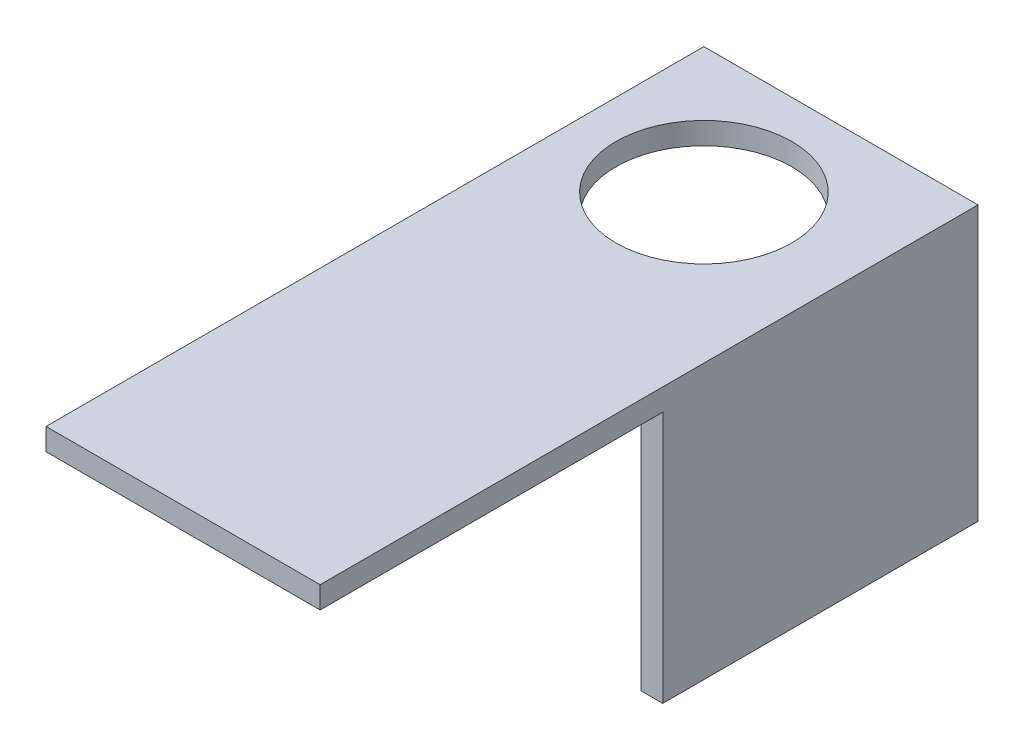
ISO-10303-21;
HEADER;
FILE_DESCRIPTION(('STEP AP214'),'2;1');
FILE_NAME('part.step','',(''),(''),'','','');
FILE_SCHEMA(('AUTOMOTIVE_DESIGN { 1 0 10303 214 1 1 1 1 }'));
ENDSEC;
DATA;
#1=APPLICATION_CONTEXT('core data for automotive mechanical design processes');
#2=APPLICATION_PROTOCOL_DEFINITION('international standard','automotive_design',2000,#1);
#3=PRODUCT_CONTEXT('',#1,'mechanical');
#4=PRODUCT('Part','Part','',(#3));
#5=PRODUCT_RELATED_PRODUCT_CATEGORY('part','',(#4));
#6=PRODUCT_DEFINITION_FORMATION('','',#4);
#7=PRODUCT_DEFINITION_CONTEXT('part definition',#1,'design');
#8=PRODUCT_DEFINITION('design','',#6,#7);
#9=PRODUCT_DEFINITION_SHAPE('','',#8);
#10=(LENGTH_UNIT() NAMED_UNIT(*) SI_UNIT(.MILLI.,.METRE.));
#11=(NAMED_UNIT(*) PLANE_ANGLE_UNIT() SI_UNIT($,.RADIAN.));
#12=(NAMED_UNIT(*) SI_UNIT($,.STERADIAN.) SOLID_ANGLE_UNIT());
#13=UNCERTAINTY_MEASURE_WITH_UNIT(LENGTH_MEASURE(1.E-05),#10,'distance_accuracy_value','');
#14=(GEOMETRIC_REPRESENTATION_CONTEXT(3) GLOBAL_UNCERTAINTY_ASSIGNED_CONTEXT((#13)) GLOBAL_UNIT_ASSIGNED_CONTEXT((#10,
#11,#12)) REPRESENTATION_CONTEXT('',''));
#15=CARTESIAN_POINT('',(0.,0.,0.));
#16=DIRECTION('',(0.,0.,1.));
#17=DIRECTION('',(1.,0.,0.));
#18=AXIS2_PLACEMENT_3D('',#15,#16,#17);
#19=CARTESIAN_POINT('',(-124.610735746152,44.9639966273187,120.));
#20=DIRECTION('',(1.,0.,0.));
#21=DIRECTION('',(0.,0.,-1.));
#22=AXIS2_PLACEMENT_3D('',#19,#20,#21);
#23=PLANE('',#22);
#24=DIRECTION('',(0.,-1.,0.));
#25=VECTOR('',#24,1.);
#26=CARTESIAN_POINT('',(-124.610735746152,44.9639966273187,0.));
#27=LINE('',#26,#25);
#28=CARTESIAN_POINT('',(-124.610735746152,44.9639966273187,0.));
#29=VERTEX_POINT('',#28);
#30=CARTESIAN_POINT('',(-124.610735746152,40.9639966273187,0.));
#31=VERTEX_POINT('',#30);
#32=EDGE_CURVE('E116',#29,#31,#27,.T.);
#33=ORIENTED_EDGE('',*,*,#32,.T.);
#34=DIRECTION('',(0.,0.,-1.));
#35=VECTOR('',#34,1.);
#36=CARTESIAN_POINT('',(-124.610735746152,40.9639966273187,120.));
#37=LINE('',#36,#35);
#38=CARTESIAN_POINT('',(-124.610735746152,40.9639966273187,120.));
#39=VERTEX_POINT('',#38);
#40=EDGE_CURVE('E40',#39,#31,#37,.T.);
#41=ORIENTED_EDGE('',*,*,#40,.F.);
#42=DIRECTION('',(0.,-1.,0.));
#43=VECTOR('',#42,1.);
#44=CARTESIAN_POINT('',(-124.610735746152,44.9639966273187,120.));
#45=LINE('',#44,#43);
#46=CARTESIAN_POINT('',(-124.610735746152,44.9639966273187,120.));
#47=VERTEX_POINT('',#46);
#48=EDGE_CURVE('E120',#47,#39,#45,.T.);
#49=ORIENTED_EDGE('',*,*,#48,.F.);
#50=DIRECTION('',(0.,0.,-1.));
#51=VECTOR('',#50,1.);
#52=CARTESIAN_POINT('',(-124.610735746152,44.9639966273187,120.));
#53=LINE('',#52,#51);
#54=EDGE_CURVE('E125',#47,#29,#53,.T.);
#55=ORIENTED_EDGE('',*,*,#54,.T.);
#56=EDGE_LOOP('',(#33,#41,#49,#55));
#57=FACE_BOUND('',#56,.T.);
#58=ADVANCED_FACE('F32',(#57),#23,.F.);
#59=CARTESIAN_POINT('',(-124.610735746152,40.9639966273187,120.));
#60=DIRECTION('',(0.,1.,0.));
#61=DIRECTION('',(0.,0.,1.));
#62=AXIS2_PLACEMENT_3D('',#59,#60,#61);
#63=PLANE('',#62);
#64=CARTESIAN_POINT('',(-101.610735746152,40.9639966273187,23.));
#65=DIRECTION('',(0.,1.,0.));
#66=DIRECTION('',(0.,0.,1.));
#67=AXIS2_PLACEMENT_3D('',#64,#65,#66);
#68=CIRCLE('',#67,16.0398057371052);
#69=CARTESIAN_POINT('',(-101.610735746152,40.9639966273187,6.96019426289482));
#70=VERTEX_POINT('',#69);
#71=EDGE_CURVE('E109',#70,#70,#68,.T.);
#72=ORIENTED_EDGE('',*,*,#71,.T.);
#73=EDGE_LOOP('',(#72));
#74=FACE_BOUND('',#73,.T.);
#75=DIRECTION('',(0.,0.,-1.));
#76=VECTOR('',#75,1.);
#77=CARTESIAN_POINT('',(-78.6107357461524,40.9639966273187,120.));
#78=LINE('',#77,#76);
#79=CARTESIAN_POINT('',(-78.6107357461524,40.9639966273187,57.5));
#80=VERTEX_POINT('',#79);
#81=CARTESIAN_POINT('',(-78.6107357461524,40.9639966273187,0.));
#82=VERTEX_POINT('',#81);
#83=EDGE_CURVE('E108',#80,#82,#78,.T.);
#84=ORIENTED_EDGE('',*,*,#83,.F.);
#85=DIRECTION('',(-1.,0.,0.));
#86=VECTOR('',#85,1.);
#87=CARTESIAN_POINT('',(-43.6107357461524,40.9639966273187,57.5));
#88=LINE('',#87,#86);
#89=CARTESIAN_POINT('',(-74.6107357461524,40.9639966273187,57.5));
#90=VERTEX_POINT('',#89);
#91=EDGE_CURVE('E96',#90,#80,#88,.T.);
#92=ORIENTED_EDGE('',*,*,#91,.F.);
#93=DIRECTION('',(0.,0.,-1.));
#94=VECTOR('',#93,1.);
#95=CARTESIAN_POINT('',(-74.6107357461524,40.9639966273187,120.));
#96=LINE('',#95,#94);
#97=CARTESIAN_POINT('',(-74.6107357461524,40.9639966273187,120.));
#98=VERTEX_POINT('',#97);
#99=EDGE_CURVE('E105',#98,#90,#96,.T.);
#100=ORIENTED_EDGE('',*,*,#99,.F.);
#101=DIRECTION('',(1.,0.,0.));
#102=VECTOR('',#101,1.);
#103=CARTESIAN_POINT('',(-124.610735746152,40.9639966273187,120.));
#104=LINE('',#103,#102);
#105=EDGE_CURVE('E47',#39,#98,#104,.T.);
#106=ORIENTED_EDGE('',*,*,#105,.F.);
#107=ORIENTED_EDGE('',*,*,#40,.T.);
#108=DIRECTION('',(1.,0.,0.));
#109=VECTOR('',#108,1.);
#110=CARTESIAN_POINT('',(-124.610735746152,40.9639966273187,0.));
#111=LINE('',#110,#109);
#112=EDGE_CURVE('E128',#31,#82,#111,.T.);
#113=ORIENTED_EDGE('',*,*,#112,.T.);
#114=EDGE_LOOP('',(#84,#92,#100,#106,#107,#113));
#115=FACE_BOUND('',#114,.T.);
#116=ADVANCED_FACE('F104',(#74,#115),#63,.F.);
#117=CARTESIAN_POINT('',(-78.6107357461524,40.9639966273187,120.));
#118=DIRECTION('',(1.,0.,0.));
#119=DIRECTION('',(0.,0.,-1.));
#120=AXIS2_PLACEMENT_3D('',#117,#118,#119);
#121=PLANE('',#120);
#122=DIRECTION('',(0.,0.,-1.));
#123=VECTOR('',#122,1.);
#124=CARTESIAN_POINT('',(-78.6107357461524,-5.03600337268127,120.));
#125=LINE('',#124,#123);
#126=CARTESIAN_POINT('',(-78.6107357461524,-5.03600337268127,57.5));
#127=VERTEX_POINT('',#126);
#128=CARTESIAN_POINT('',(-78.6107357461524,-5.03600337268127,0.));
#129=VERTEX_POINT('',#128);
#130=EDGE_CURVE('E144',#127,#129,#125,.T.);
#131=ORIENTED_EDGE('',*,*,#130,.F.);
#132=DIRECTION('',(0.,1.,0.));
#133=VECTOR('',#132,1.);
#134=CARTESIAN_POINT('',(-78.6107357461524,40.9639966273187,57.5));
#135=LINE('',#134,#133);
#136=EDGE_CURVE('E114',#127,#80,#135,.T.);
#137=ORIENTED_EDGE('',*,*,#136,.T.);
#138=ORIENTED_EDGE('',*,*,#83,.T.);
#139=DIRECTION('',(0.,-1.,0.));
#140=VECTOR('',#139,1.);
#141=CARTESIAN_POINT('',(-78.6107357461524,40.9639966273187,0.));
#142=LINE('',#141,#140);
#143=EDGE_CURVE('E130',#82,#129,#142,.T.);
#144=ORIENTED_EDGE('',*,*,#143,.T.);
#145=EDGE_LOOP('',(#131,#137,#138,#144));
#146=FACE_BOUND('',#145,.T.);
#147=ADVANCED_FACE('F162',(#146),#121,.F.);
#148=CARTESIAN_POINT('',(-78.6107357461524,-5.03600337268127,120.));
#149=DIRECTION('',(0.,1.,0.));
#150=DIRECTION('',(0.,0.,1.));
#151=AXIS2_PLACEMENT_3D('',#148,#149,#150);
#152=PLANE('',#151);
#153=DIRECTION('',(0.,0.,-1.));
#154=VECTOR('',#153,1.);
#155=CARTESIAN_POINT('',(-74.6107357461524,-5.03600337268127,120.));
#156=LINE('',#155,#154);
#157=CARTESIAN_POINT('',(-74.6107357461524,-5.03600337268127,57.5));
#158=VERTEX_POINT('',#157);
#159=CARTESIAN_POINT('',(-74.6107357461524,-5.03600337268127,0.));
#160=VERTEX_POINT('',#159);
#161=EDGE_CURVE('E142',#158,#160,#156,.T.);
#162=ORIENTED_EDGE('',*,*,#161,.F.);
#163=DIRECTION('',(-1.,0.,0.));
#164=VECTOR('',#163,1.);
#165=CARTESIAN_POINT('',(-43.6107357461524,-5.03600337268127,57.5));
#166=LINE('',#165,#164);
#167=EDGE_CURVE('E99',#158,#127,#166,.T.);
#168=ORIENTED_EDGE('',*,*,#167,.T.);
#169=ORIENTED_EDGE('',*,*,#130,.T.);
#170=DIRECTION('',(1.,0.,0.));
#171=VECTOR('',#170,1.);
#172=CARTESIAN_POINT('',(-78.6107357461524,-5.03600337268127,0.));
#173=LINE('',#172,#171);
#174=EDGE_CURVE('E133',#129,#160,#173,.T.);
#175=ORIENTED_EDGE('',*,*,#174,.T.);
#176=EDGE_LOOP('',(#162,#168,#169,#175));
#177=FACE_BOUND('',#176,.T.);
#178=ADVANCED_FACE('F159',(#177),#152,.F.);
#179=CARTESIAN_POINT('',(-74.6107357461524,44.9639966273187,120.));
#180=DIRECTION('',(-1.,0.,0.));
#181=DIRECTION('',(0.,0.,1.));
#182=AXIS2_PLACEMENT_3D('',#179,#180,#181);
#183=PLANE('',#182);
#184=ORIENTED_EDGE('',*,*,#99,.T.);
#185=DIRECTION('',(0.,-1.,0.));
#186=VECTOR('',#185,1.);
#187=CARTESIAN_POINT('',(-74.6107357461524,44.9639966273187,57.5));
#188=LINE('',#187,#186);
#189=EDGE_CURVE('E11',#90,#158,#188,.T.);
#190=ORIENTED_EDGE('',*,*,#189,.T.);
#191=ORIENTED_EDGE('',*,*,#161,.T.);
#192=DIRECTION('',(0.,1.,0.));
#193=VECTOR('',#192,1.);
#194=CARTESIAN_POINT('',(-74.6107357461524,44.9639966273187,0.));
#195=LINE('',#194,#193);
#196=CARTESIAN_POINT('',(-74.6107357461524,44.9639966273187,0.));
#197=VERTEX_POINT('',#196);
#198=EDGE_CURVE('E136',#160,#197,#195,.T.);
#199=ORIENTED_EDGE('',*,*,#198,.T.);
#200=DIRECTION('',(0.,0.,-1.));
#201=VECTOR('',#200,1.);
#202=CARTESIAN_POINT('',(-74.6107357461524,44.9639966273187,120.));
#203=LINE('',#202,#201);
#204=CARTESIAN_POINT('',(-74.6107357461524,44.9639966273187,120.));
#205=VERTEX_POINT('',#204);
#206=EDGE_CURVE('E140',#205,#197,#203,.T.);
#207=ORIENTED_EDGE('',*,*,#206,.F.);
#208=DIRECTION('',(0.,1.,0.));
#209=VECTOR('',#208,1.);
#210=CARTESIAN_POINT('',(-74.6107357461524,44.9639966273187,120.));
#211=LINE('',#210,#209);
#212=EDGE_CURVE('E113',#98,#205,#211,.T.);
#213=ORIENTED_EDGE('',*,*,#212,.F.);
#214=EDGE_LOOP('',(#184,#190,#191,#199,#207,#213));
#215=FACE_BOUND('',#214,.T.);
#216=ADVANCED_FACE('F111',(#215),#183,.F.);
#217=CARTESIAN_POINT('',(-124.610735746152,44.9639966273187,120.));
#218=DIRECTION('',(0.,-1.,0.));
#219=DIRECTION('',(0.,0.,-1.));
#220=AXIS2_PLACEMENT_3D('',#217,#218,#219);
#221=PLANE('',#220);
#222=CARTESIAN_POINT('',(-101.610735746152,44.9639966273187,23.));
#223=DIRECTION('',(0.,-1.,0.));
#224=DIRECTION('',(0.,0.,-1.));
#225=AXIS2_PLACEMENT_3D('',#222,#223,#224);
#226=CIRCLE('',#225,16.0398057371052);
#227=CARTESIAN_POINT('',(-101.610735746152,44.9639966273187,6.96019426289482));
#228=VERTEX_POINT('',#227);
#229=EDGE_CURVE('E35',#228,#228,#226,.T.);
#230=ORIENTED_EDGE('',*,*,#229,.T.);
#231=EDGE_LOOP('',(#230));
#232=FACE_BOUND('',#231,.T.);
#233=DIRECTION('',(-1.,0.,0.));
#234=VECTOR('',#233,1.);
#235=CARTESIAN_POINT('',(-124.610735746152,44.9639966273187,0.));
#236=LINE('',#235,#234);
#237=EDGE_CURVE('E79',#197,#29,#236,.T.);
#238=ORIENTED_EDGE('',*,*,#237,.T.);
#239=ORIENTED_EDGE('',*,*,#54,.F.);
#240=DIRECTION('',(-1.,0.,0.));
#241=VECTOR('',#240,1.);
#242=CARTESIAN_POINT('',(-124.610735746152,44.9639966273187,120.));
#243=LINE('',#242,#241);
#244=EDGE_CURVE('E53',#205,#47,#243,.T.);
#245=ORIENTED_EDGE('',*,*,#244,.F.);
#246=ORIENTED_EDGE('',*,*,#206,.T.);
#247=EDGE_LOOP('',(#238,#239,#245,#246));
#248=FACE_BOUND('',#247,.T.);
#249=ADVANCED_FACE('F156',(#232,#248),#221,.F.);
#250=CARTESIAN_POINT('',(-124.610735746152,40.9639966273187,120.));
#251=DIRECTION('',(0.,0.,1.));
#252=DIRECTION('',(1.,0.,0.));
#253=AXIS2_PLACEMENT_3D('',#250,#251,#252);
#254=PLANE('',#253);
#255=ORIENTED_EDGE('',*,*,#105,.T.);
#256=ORIENTED_EDGE('',*,*,#212,.T.);
#257=ORIENTED_EDGE('',*,*,#244,.T.);
#258=ORIENTED_EDGE('',*,*,#48,.T.);
#259=EDGE_LOOP('',(#255,#256,#257,#258));
#260=FACE_BOUND('',#259,.T.);
#261=ADVANCED_FACE('F195',(#260),#254,.T.);
#262=CARTESIAN_POINT('',(-124.610735746152,40.9639966273187,0.));
#263=DIRECTION('',(0.,0.,1.));
#264=DIRECTION('',(1.,0.,0.));
#265=AXIS2_PLACEMENT_3D('',#262,#263,#264);
#266=PLANE('',#265);
#267=ORIENTED_EDGE('',*,*,#32,.F.);
#268=ORIENTED_EDGE('',*,*,#237,.F.);
#269=ORIENTED_EDGE('',*,*,#198,.F.);
#270=ORIENTED_EDGE('',*,*,#174,.F.);
#271=ORIENTED_EDGE('',*,*,#143,.F.);
#272=ORIENTED_EDGE('',*,*,#112,.F.);
#273=EDGE_LOOP('',(#267,#268,#269,#270,#271,#272));
#274=FACE_BOUND('',#273,.T.);
#275=ADVANCED_FACE('F154',(#274),#266,.F.);
#276=CARTESIAN_POINT('',(-43.6107357461524,40.9639966273187,57.5));
#277=DIRECTION('',(0.,0.,-1.));
#278=DIRECTION('',(-1.,0.,0.));
#279=AXIS2_PLACEMENT_3D('',#276,#277,#278);
#280=PLANE('',#279);
#281=ORIENTED_EDGE('',*,*,#167,.F.);
#282=ORIENTED_EDGE('',*,*,#189,.F.);
#283=ORIENTED_EDGE('',*,*,#91,.T.);
#284=ORIENTED_EDGE('',*,*,#136,.F.);
#285=EDGE_LOOP('',(#281,#282,#283,#284));
#286=FACE_BOUND('',#285,.T.);
#287=ADVANCED_FACE('F95',(#286),#280,.F.);
#288=CARTESIAN_POINT('',(-101.610735746152,82.9639966273187,23.));
#289=DIRECTION('',(0.,-1.,0.));
#290=DIRECTION('',(0.,0.,-1.));
#291=AXIS2_PLACEMENT_3D('',#288,#289,#290);
#292=CYLINDRICAL_SURFACE('',#291,16.0398057371052);
#293=CARTESIAN_POINT('',(-101.610735746152,44.9639966273187,6.96019426289482));
#294=CARTESIAN_POINT('',(-101.610735746152,44.9223299606521,6.96019426289482));
#295=CARTESIAN_POINT('',(-101.610735746152,44.8806632939854,6.96019426289482));
#296=CARTESIAN_POINT('',(-101.610735746152,44.7973299606521,6.96019426289482));
#297=CARTESIAN_POINT('',(-101.610735746152,44.7556632939854,6.96019426289482));
#298=CARTESIAN_POINT('',(-101.610735746152,44.6723299606521,6.96019426289482));
#299=CARTESIAN_POINT('',(-101.610735746152,44.6306632939854,6.96019426289482));
#300=CARTESIAN_POINT('',(-101.610735746152,44.5473299606521,6.96019426289482));
#301=CARTESIAN_POINT('',(-101.610735746152,44.5056632939854,6.96019426289482));
#302=CARTESIAN_POINT('',(-101.610735746152,44.4223299606521,6.96019426289482));
#303=CARTESIAN_POINT('',(-101.610735746152,44.3806632939854,6.96019426289482));
#304=CARTESIAN_POINT('',(-101.610735746152,44.2973299606521,6.96019426289482));
#305=CARTESIAN_POINT('',(-101.610735746152,44.2556632939854,6.96019426289482));
#306=CARTESIAN_POINT('',(-101.610735746152,44.1723299606521,6.96019426289482));
#307=CARTESIAN_POINT('',(-101.610735746152,44.1306632939854,6.96019426289482));
#308=CARTESIAN_POINT('',(-101.610735746152,44.0473299606521,6.96019426289482));
#309=CARTESIAN_POINT('',(-101.610735746152,44.0056632939854,6.96019426289482));
#310=CARTESIAN_POINT('',(-101.610735746152,43.9223299606521,6.96019426289482));
#311=CARTESIAN_POINT('',(-101.610735746152,43.8806632939854,6.96019426289482));
#312=CARTESIAN_POINT('',(-101.610735746152,43.7973299606521,6.96019426289482));
#313=CARTESIAN_POINT('',(-101.610735746152,43.7556632939854,6.96019426289482));
#314=CARTESIAN_POINT('',(-101.610735746152,43.6723299606521,6.96019426289482));
#315=CARTESIAN_POINT('',(-101.610735746152,43.6306632939854,6.96019426289482));
#316=CARTESIAN_POINT('',(-101.610735746152,43.5473299606521,6.96019426289482));
#317=CARTESIAN_POINT('',(-101.610735746152,43.5056632939854,6.96019426289482));
#318=CARTESIAN_POINT('',(-101.610735746152,43.4223299606521,6.96019426289482));
#319=CARTESIAN_POINT('',(-101.610735746152,43.3806632939854,6.96019426289482));
#320=CARTESIAN_POINT('',(-101.610735746152,43.2973299606521,6.96019426289482));
#321=CARTESIAN_POINT('',(-101.610735746152,43.2556632939854,6.96019426289482));
#322=CARTESIAN_POINT('',(-101.610735746152,43.1723299606521,6.96019426289482));
#323=CARTESIAN_POINT('',(-101.610735746152,43.1306632939854,6.96019426289482));
#324=CARTESIAN_POINT('',(-101.610735746152,43.0473299606521,6.96019426289482));
#325=CARTESIAN_POINT('',(-101.610735746152,43.0056632939854,6.96019426289482));
#326=CARTESIAN_POINT('',(-101.610735746152,42.9223299606521,6.96019426289482));
#327=CARTESIAN_POINT('',(-101.610735746152,42.8806632939854,6.96019426289482));
#328=CARTESIAN_POINT('',(-101.610735746152,42.7973299606521,6.96019426289482));
#329=CARTESIAN_POINT('',(-101.610735746152,42.7556632939854,6.96019426289482));
#330=CARTESIAN_POINT('',(-101.610735746152,42.6723299606521,6.96019426289482));
#331=CARTESIAN_POINT('',(-101.610735746152,42.6306632939854,6.96019426289482));
#332=CARTESIAN_POINT('',(-101.610735746152,42.5473299606521,6.96019426289482));
#333=CARTESIAN_POINT('',(-101.610735746152,42.5056632939854,6.96019426289482));
#334=CARTESIAN_POINT('',(-101.610735746152,42.4223299606521,6.96019426289482));
#335=CARTESIAN_POINT('',(-101.610735746152,42.3806632939854,6.96019426289482));
#336=CARTESIAN_POINT('',(-101.610735746152,42.2973299606521,6.96019426289482));
#337=CARTESIAN_POINT('',(-101.610735746152,42.2556632939854,6.96019426289482));
#338=CARTESIAN_POINT('',(-101.610735746152,42.1723299606521,6.96019426289482));
#339=CARTESIAN_POINT('',(-101.610735746152,42.1306632939854,6.96019426289482));
#340=CARTESIAN_POINT('',(-101.610735746152,42.0473299606521,6.96019426289482));
#341=CARTESIAN_POINT('',(-101.610735746152,42.0056632939854,6.96019426289482));
#342=CARTESIAN_POINT('',(-101.610735746152,41.922329960652,6.96019426289482));
#343=CARTESIAN_POINT('',(-101.610735746152,41.8806632939854,6.96019426289482));
#344=CARTESIAN_POINT('',(-101.610735746152,41.797329960652,6.96019426289482));
#345=CARTESIAN_POINT('',(-101.610735746152,41.7556632939854,6.96019426289482));
#346=CARTESIAN_POINT('',(-101.610735746152,41.672329960652,6.96019426289482));
#347=CARTESIAN_POINT('',(-101.610735746152,41.6306632939854,6.96019426289482));
#348=CARTESIAN_POINT('',(-101.610735746152,41.547329960652,6.96019426289482));
#349=CARTESIAN_POINT('',(-101.610735746152,41.5056632939854,6.96019426289482));
#350=CARTESIAN_POINT('',(-101.610735746152,41.422329960652,6.96019426289482));
#351=CARTESIAN_POINT('',(-101.610735746152,41.3806632939854,6.96019426289482));
#352=CARTESIAN_POINT('',(-101.610735746152,41.297329960652,6.96019426289482));
#353=CARTESIAN_POINT('',(-101.610735746152,41.2556632939854,6.96019426289482));
#354=CARTESIAN_POINT('',(-101.610735746152,41.172329960652,6.96019426289482));
#355=CARTESIAN_POINT('',(-101.610735746152,41.1306632939854,6.96019426289482));
#356=CARTESIAN_POINT('',(-101.610735746152,41.047329960652,6.96019426289482));
#357=CARTESIAN_POINT('',(-101.610735746152,41.0056632939854,6.96019426289482));
#358=CARTESIAN_POINT('',(-101.610735746152,40.9639966273187,6.96019426289482));
#359=B_SPLINE_CURVE_WITH_KNOTS('',3,(#293,#294,#295,#296,#297,#298,#299,#300,#301,#302,#303,
#304,#305,#306,#307,#308,#309,#310,#311,#312,#313,#314,#315,#316,#317,#318,#319,#320,#321,#322,
#323,#324,#325,#326,#327,#328,#329,#330,#331,#332,#333,#334,#335,#336,#337,#338,#339,#340,#341,
#342,#343,#344,#345,#346,#347,#348,#349,#350,#351,#352,#353,#354,#355,#356,#357,#358),
.UNSPECIFIED.,.F.,.F.,(4,2,2,2,2,2,2,2,2,2,2,2,2,2,2,2,2,2,2,2,2,2,2,2,2,2,2,2,2,2,2,2,4),(0.,
0.125,0.25,0.375,0.5,0.625000000000001,0.750000000000001,0.875000000000001,1.,1.12500000000001,
1.25000000000001,1.37500000000001,1.50000000000001,1.62500000000001,1.75000000000001,
1.87500000000001,2.00000000000001,2.12500000000001,2.25000000000001,2.37500000000001,
2.50000000000001,2.62500000000001,2.75000000000001,2.87500000000001,3.00000000000002,
3.12500000000002,3.25000000000002,3.37500000000002,3.50000000000002,3.62500000000002,
3.75000000000002,3.87500000000002,4.00000000000002),.UNSPECIFIED.);
#360=EDGE_CURVE('BSEAM205',#228,#70,#359,.T.);
#361=ORIENTED_EDGE('',*,*,#229,.F.);
#362=ORIENTED_EDGE('',*,*,#71,.F.);
#363=ORIENTED_EDGE('',*,*,#360,.T.);
#364=ORIENTED_EDGE('',*,*,#360,.F.);
#365=EDGE_LOOP('',(#361,#363,#362,#364));
#366=FACE_BOUND('',#365,.T.);
#367=ADVANCED_FACE('F205',(#366),#292,.F.);
#368=CLOSED_SHELL('',(#58,#116,#147,#178,#216,#249,#261,#275,#287,#367));
#369=MANIFOLD_SOLID_BREP('B2',#368);
#370=ADVANCED_BREP_SHAPE_REPRESENTATION('',(#18,#369),#14);
#371=SHAPE_DEFINITION_REPRESENTATION(#9,#370);
ENDSEC;
END-ISO-10303-21;
